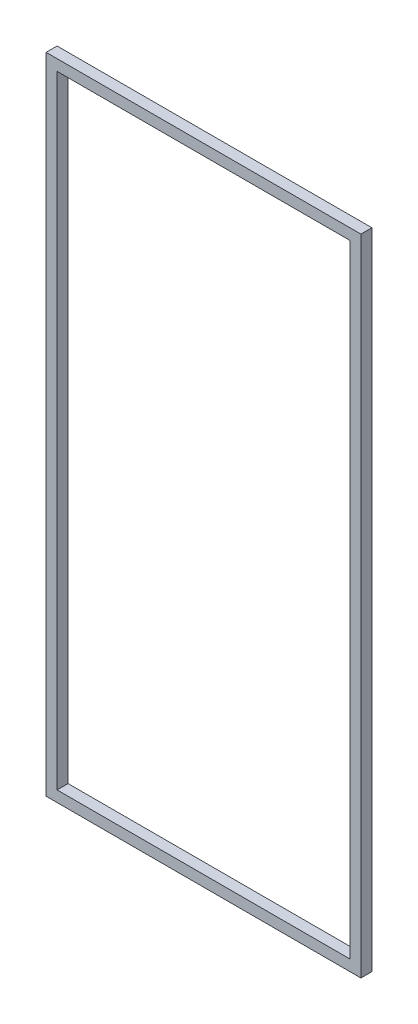
ISO-10303-21;
HEADER;
FILE_DESCRIPTION(('STEP AP214'),'2;1');
FILE_NAME('part.step','',(''),(''),'','','');
FILE_SCHEMA(('AUTOMOTIVE_DESIGN { 1 0 10303 214 1 1 1 1 }'));
ENDSEC;
DATA;
#1=APPLICATION_CONTEXT('core data for automotive mechanical design processes');
#2=APPLICATION_PROTOCOL_DEFINITION('international standard','automotive_design',2000,#1);
#3=PRODUCT_CONTEXT('',#1,'mechanical');
#4=PRODUCT('Part','Part','',(#3));
#5=PRODUCT_RELATED_PRODUCT_CATEGORY('part','',(#4));
#6=PRODUCT_DEFINITION_FORMATION('','',#4);
#7=PRODUCT_DEFINITION_CONTEXT('part definition',#1,'design');
#8=PRODUCT_DEFINITION('design','',#6,#7);
#9=PRODUCT_DEFINITION_SHAPE('','',#8);
#10=(LENGTH_UNIT() NAMED_UNIT(*) SI_UNIT(.MILLI.,.METRE.));
#11=(NAMED_UNIT(*) PLANE_ANGLE_UNIT() SI_UNIT($,.RADIAN.));
#12=(NAMED_UNIT(*) SI_UNIT($,.STERADIAN.) SOLID_ANGLE_UNIT());
#13=UNCERTAINTY_MEASURE_WITH_UNIT(LENGTH_MEASURE(1.E-05),#10,'distance_accuracy_value','');
#14=(GEOMETRIC_REPRESENTATION_CONTEXT(3) GLOBAL_UNCERTAINTY_ASSIGNED_CONTEXT((#13)) GLOBAL_UNIT_ASSIGNED_CONTEXT((#10,
#11,#12)) REPRESENTATION_CONTEXT('',''));
#15=CARTESIAN_POINT('',(0.,0.,0.));
#16=DIRECTION('',(0.,0.,1.));
#17=DIRECTION('',(1.,0.,0.));
#18=AXIS2_PLACEMENT_3D('',#15,#16,#17);
#19=CARTESIAN_POINT('',(0.,0.,15.));
#20=DIRECTION('',(0.,0.,1.));
#21=DIRECTION('',(1.,0.,0.));
#22=AXIS2_PLACEMENT_3D('',#19,#20,#21);
#23=PLANE('',#22);
#24=DIRECTION('',(0.,1.,0.));
#25=VECTOR('',#24,1.);
#26=CARTESIAN_POINT('',(215.,425.,15.));
#27=LINE('',#26,#25);
#28=CARTESIAN_POINT('',(215.,-440.,15.));
#29=VERTEX_POINT('',#28);
#30=CARTESIAN_POINT('',(215.,440.,15.));
#31=VERTEX_POINT('',#30);
#32=EDGE_CURVE('E160',#29,#31,#27,.T.);
#33=ORIENTED_EDGE('',*,*,#32,.T.);
#34=DIRECTION('',(-1.,0.,0.));
#35=VECTOR('',#34,1.);
#36=CARTESIAN_POINT('',(-200.,440.,15.));
#37=LINE('',#36,#35);
#38=CARTESIAN_POINT('',(-215.,440.,15.));
#39=VERTEX_POINT('',#38);
#40=EDGE_CURVE('E163',#31,#39,#37,.T.);
#41=ORIENTED_EDGE('',*,*,#40,.T.);
#42=DIRECTION('',(0.,-1.,0.));
#43=VECTOR('',#42,1.);
#44=CARTESIAN_POINT('',(-215.,425.,15.));
#45=LINE('',#44,#43);
#46=CARTESIAN_POINT('',(-215.,-440.,15.));
#47=VERTEX_POINT('',#46);
#48=EDGE_CURVE('E166',#39,#47,#45,.T.);
#49=ORIENTED_EDGE('',*,*,#48,.T.);
#50=DIRECTION('',(1.,0.,0.));
#51=VECTOR('',#50,1.);
#52=CARTESIAN_POINT('',(-200.,-440.,15.));
#53=LINE('',#52,#51);
#54=EDGE_CURVE('E168',#47,#29,#53,.T.);
#55=ORIENTED_EDGE('',*,*,#54,.T.);
#56=EDGE_LOOP('',(#33,#41,#49,#55));
#57=FACE_BOUND('',#56,.T.);
#58=DIRECTION('',(-1.,0.,0.));
#59=VECTOR('',#58,1.);
#60=CARTESIAN_POINT('',(-200.,425.,15.));
#61=LINE('',#60,#59);
#62=CARTESIAN_POINT('',(200.,425.,15.));
#63=VERTEX_POINT('',#62);
#64=CARTESIAN_POINT('',(-200.,425.,15.));
#65=VERTEX_POINT('',#64);
#66=EDGE_CURVE('E132',#63,#65,#61,.T.);
#67=ORIENTED_EDGE('',*,*,#66,.F.);
#68=DIRECTION('',(0.,1.,0.));
#69=VECTOR('',#68,1.);
#70=CARTESIAN_POINT('',(200.,425.,15.));
#71=LINE('',#70,#69);
#72=CARTESIAN_POINT('',(200.,-425.,15.));
#73=VERTEX_POINT('',#72);
#74=EDGE_CURVE('E124',#73,#63,#71,.T.);
#75=ORIENTED_EDGE('',*,*,#74,.F.);
#76=DIRECTION('',(1.,0.,0.));
#77=VECTOR('',#76,1.);
#78=CARTESIAN_POINT('',(-200.,-425.,15.));
#79=LINE('',#78,#77);
#80=CARTESIAN_POINT('',(-200.,-425.,15.));
#81=VERTEX_POINT('',#80);
#82=EDGE_CURVE('E146',#81,#73,#79,.T.);
#83=ORIENTED_EDGE('',*,*,#82,.F.);
#84=DIRECTION('',(0.,-1.,0.));
#85=VECTOR('',#84,1.);
#86=CARTESIAN_POINT('',(-200.,425.,15.));
#87=LINE('',#86,#85);
#88=EDGE_CURVE('E144',#65,#81,#87,.T.);
#89=ORIENTED_EDGE('',*,*,#88,.F.);
#90=EDGE_LOOP('',(#67,#75,#83,#89));
#91=FACE_BOUND('',#90,.T.);
#92=ADVANCED_FACE('F59',(#57,#91),#23,.T.);
#93=CARTESIAN_POINT('',(0.,0.,0.));
#94=DIRECTION('',(0.,0.,1.));
#95=DIRECTION('',(1.,0.,0.));
#96=AXIS2_PLACEMENT_3D('',#93,#94,#95);
#97=PLANE('',#96);
#98=DIRECTION('',(0.,1.,0.));
#99=VECTOR('',#98,1.);
#100=CARTESIAN_POINT('',(215.,425.,0.));
#101=LINE('',#100,#99);
#102=CARTESIAN_POINT('',(215.,-440.,0.));
#103=VERTEX_POINT('',#102);
#104=CARTESIAN_POINT('',(215.,440.,0.));
#105=VERTEX_POINT('',#104);
#106=EDGE_CURVE('E140',#103,#105,#101,.T.);
#107=ORIENTED_EDGE('',*,*,#106,.F.);
#108=DIRECTION('',(1.,0.,0.));
#109=VECTOR('',#108,1.);
#110=CARTESIAN_POINT('',(-200.,-440.,0.));
#111=LINE('',#110,#109);
#112=CARTESIAN_POINT('',(-215.,-440.,0.));
#113=VERTEX_POINT('',#112);
#114=EDGE_CURVE('E164',#113,#103,#111,.T.);
#115=ORIENTED_EDGE('',*,*,#114,.F.);
#116=DIRECTION('',(0.,-1.,0.));
#117=VECTOR('',#116,1.);
#118=CARTESIAN_POINT('',(-215.,425.,0.));
#119=LINE('',#118,#117);
#120=CARTESIAN_POINT('',(-215.,440.,0.));
#121=VERTEX_POINT('',#120);
#122=EDGE_CURVE('E175',#121,#113,#119,.T.);
#123=ORIENTED_EDGE('',*,*,#122,.F.);
#124=DIRECTION('',(-1.,0.,0.));
#125=VECTOR('',#124,1.);
#126=CARTESIAN_POINT('',(-200.,440.,0.));
#127=LINE('',#126,#125);
#128=EDGE_CURVE('E173',#105,#121,#127,.T.);
#129=ORIENTED_EDGE('',*,*,#128,.F.);
#130=EDGE_LOOP('',(#107,#115,#123,#129));
#131=FACE_BOUND('',#130,.T.);
#132=DIRECTION('',(0.,1.,0.));
#133=VECTOR('',#132,1.);
#134=CARTESIAN_POINT('',(200.,425.,0.));
#135=LINE('',#134,#133);
#136=CARTESIAN_POINT('',(200.,-425.,0.));
#137=VERTEX_POINT('',#136);
#138=CARTESIAN_POINT('',(200.,425.,0.));
#139=VERTEX_POINT('',#138);
#140=EDGE_CURVE('E82',#137,#139,#135,.T.);
#141=ORIENTED_EDGE('',*,*,#140,.T.);
#142=DIRECTION('',(-1.,0.,0.));
#143=VECTOR('',#142,1.);
#144=CARTESIAN_POINT('',(-200.,425.,0.));
#145=LINE('',#144,#143);
#146=CARTESIAN_POINT('',(-200.,425.,0.));
#147=VERTEX_POINT('',#146);
#148=EDGE_CURVE('E139',#139,#147,#145,.T.);
#149=ORIENTED_EDGE('',*,*,#148,.T.);
#150=DIRECTION('',(0.,-1.,0.));
#151=VECTOR('',#150,1.);
#152=CARTESIAN_POINT('',(-200.,425.,0.));
#153=LINE('',#152,#151);
#154=CARTESIAN_POINT('',(-200.,-425.,0.));
#155=VERTEX_POINT('',#154);
#156=EDGE_CURVE('E152',#147,#155,#153,.T.);
#157=ORIENTED_EDGE('',*,*,#156,.T.);
#158=DIRECTION('',(1.,0.,0.));
#159=VECTOR('',#158,1.);
#160=CARTESIAN_POINT('',(-200.,-425.,0.));
#161=LINE('',#160,#159);
#162=EDGE_CURVE('E133',#155,#137,#161,.T.);
#163=ORIENTED_EDGE('',*,*,#162,.T.);
#164=EDGE_LOOP('',(#141,#149,#157,#163));
#165=FACE_BOUND('',#164,.T.);
#166=ADVANCED_FACE('F193',(#131,#165),#97,.F.);
#167=CARTESIAN_POINT('',(215.,425.,15.));
#168=DIRECTION('',(-1.,0.,0.));
#169=DIRECTION('',(0.,-1.,0.));
#170=AXIS2_PLACEMENT_3D('',#167,#168,#169);
#171=PLANE('',#170);
#172=ORIENTED_EDGE('',*,*,#106,.T.);
#173=DIRECTION('',(0.,0.,-1.));
#174=VECTOR('',#173,1.);
#175=CARTESIAN_POINT('',(215.,440.,15.));
#176=LINE('',#175,#174);
#177=EDGE_CURVE('E12',#31,#105,#176,.T.);
#178=ORIENTED_EDGE('',*,*,#177,.F.);
#179=ORIENTED_EDGE('',*,*,#32,.F.);
#180=DIRECTION('',(0.,0.,-1.));
#181=VECTOR('',#180,1.);
#182=CARTESIAN_POINT('',(215.,-440.,15.));
#183=LINE('',#182,#181);
#184=EDGE_CURVE('E170',#29,#103,#183,.T.);
#185=ORIENTED_EDGE('',*,*,#184,.T.);
#186=EDGE_LOOP('',(#172,#178,#179,#185));
#187=FACE_BOUND('',#186,.T.);
#188=ADVANCED_FACE('F61',(#187),#171,.F.);
#189=CARTESIAN_POINT('',(-200.,440.,15.));
#190=DIRECTION('',(0.,-1.,0.));
#191=DIRECTION('',(0.,0.,-1.));
#192=AXIS2_PLACEMENT_3D('',#189,#190,#191);
#193=PLANE('',#192);
#194=ORIENTED_EDGE('',*,*,#128,.T.);
#195=DIRECTION('',(0.,0.,-1.));
#196=VECTOR('',#195,1.);
#197=CARTESIAN_POINT('',(-215.,440.,15.));
#198=LINE('',#197,#196);
#199=EDGE_CURVE('E67',#39,#121,#198,.T.);
#200=ORIENTED_EDGE('',*,*,#199,.F.);
#201=ORIENTED_EDGE('',*,*,#40,.F.);
#202=ORIENTED_EDGE('',*,*,#177,.T.);
#203=EDGE_LOOP('',(#194,#200,#201,#202));
#204=FACE_BOUND('',#203,.T.);
#205=ADVANCED_FACE('F203',(#204),#193,.F.);
#206=CARTESIAN_POINT('',(-215.,425.,15.));
#207=DIRECTION('',(1.,0.,0.));
#208=DIRECTION('',(0.,1.,0.));
#209=AXIS2_PLACEMENT_3D('',#206,#207,#208);
#210=PLANE('',#209);
#211=ORIENTED_EDGE('',*,*,#122,.T.);
#212=DIRECTION('',(0.,0.,-1.));
#213=VECTOR('',#212,1.);
#214=CARTESIAN_POINT('',(-215.,-440.,15.));
#215=LINE('',#214,#213);
#216=EDGE_CURVE('E180',#47,#113,#215,.T.);
#217=ORIENTED_EDGE('',*,*,#216,.F.);
#218=ORIENTED_EDGE('',*,*,#48,.F.);
#219=ORIENTED_EDGE('',*,*,#199,.T.);
#220=EDGE_LOOP('',(#211,#217,#218,#219));
#221=FACE_BOUND('',#220,.T.);
#222=ADVANCED_FACE('F187',(#221),#210,.F.);
#223=CARTESIAN_POINT('',(-200.,-440.,15.));
#224=DIRECTION('',(0.,1.,0.));
#225=DIRECTION('',(0.,0.,1.));
#226=AXIS2_PLACEMENT_3D('',#223,#224,#225);
#227=PLANE('',#226);
#228=ORIENTED_EDGE('',*,*,#114,.T.);
#229=ORIENTED_EDGE('',*,*,#184,.F.);
#230=ORIENTED_EDGE('',*,*,#54,.F.);
#231=ORIENTED_EDGE('',*,*,#216,.T.);
#232=EDGE_LOOP('',(#228,#229,#230,#231));
#233=FACE_BOUND('',#232,.T.);
#234=ADVANCED_FACE('F197',(#233),#227,.F.);
#235=CARTESIAN_POINT('',(200.,425.,15.));
#236=DIRECTION('',(-1.,0.,0.));
#237=DIRECTION('',(0.,-1.,0.));
#238=AXIS2_PLACEMENT_3D('',#235,#236,#237);
#239=PLANE('',#238);
#240=ORIENTED_EDGE('',*,*,#140,.F.);
#241=DIRECTION('',(0.,0.,-1.));
#242=VECTOR('',#241,1.);
#243=CARTESIAN_POINT('',(200.,-425.,15.));
#244=LINE('',#243,#242);
#245=EDGE_CURVE('E128',#73,#137,#244,.T.);
#246=ORIENTED_EDGE('',*,*,#245,.F.);
#247=ORIENTED_EDGE('',*,*,#74,.T.);
#248=DIRECTION('',(0.,0.,-1.));
#249=VECTOR('',#248,1.);
#250=CARTESIAN_POINT('',(200.,425.,15.));
#251=LINE('',#250,#249);
#252=EDGE_CURVE('E127',#63,#139,#251,.T.);
#253=ORIENTED_EDGE('',*,*,#252,.T.);
#254=EDGE_LOOP('',(#240,#246,#247,#253));
#255=FACE_BOUND('',#254,.T.);
#256=ADVANCED_FACE('F126',(#255),#239,.T.);
#257=CARTESIAN_POINT('',(-200.,425.,15.));
#258=DIRECTION('',(0.,-1.,0.));
#259=DIRECTION('',(0.,0.,-1.));
#260=AXIS2_PLACEMENT_3D('',#257,#258,#259);
#261=PLANE('',#260);
#262=ORIENTED_EDGE('',*,*,#148,.F.);
#263=ORIENTED_EDGE('',*,*,#252,.F.);
#264=ORIENTED_EDGE('',*,*,#66,.T.);
#265=DIRECTION('',(0.,0.,-1.));
#266=VECTOR('',#265,1.);
#267=CARTESIAN_POINT('',(-200.,425.,15.));
#268=LINE('',#267,#266);
#269=EDGE_CURVE('E141',#65,#147,#268,.T.);
#270=ORIENTED_EDGE('',*,*,#269,.T.);
#271=EDGE_LOOP('',(#262,#263,#264,#270));
#272=FACE_BOUND('',#271,.T.);
#273=ADVANCED_FACE('F136',(#272),#261,.T.);
#274=CARTESIAN_POINT('',(-200.,425.,15.));
#275=DIRECTION('',(1.,0.,0.));
#276=DIRECTION('',(0.,1.,0.));
#277=AXIS2_PLACEMENT_3D('',#274,#275,#276);
#278=PLANE('',#277);
#279=ORIENTED_EDGE('',*,*,#156,.F.);
#280=ORIENTED_EDGE('',*,*,#269,.F.);
#281=ORIENTED_EDGE('',*,*,#88,.T.);
#282=DIRECTION('',(0.,0.,-1.));
#283=VECTOR('',#282,1.);
#284=CARTESIAN_POINT('',(-200.,-425.,15.));
#285=LINE('',#284,#283);
#286=EDGE_CURVE('E74',#81,#155,#285,.T.);
#287=ORIENTED_EDGE('',*,*,#286,.T.);
#288=EDGE_LOOP('',(#279,#280,#281,#287));
#289=FACE_BOUND('',#288,.T.);
#290=ADVANCED_FACE('F226',(#289),#278,.T.);
#291=CARTESIAN_POINT('',(-200.,-425.,15.));
#292=DIRECTION('',(0.,1.,0.));
#293=DIRECTION('',(0.,0.,1.));
#294=AXIS2_PLACEMENT_3D('',#291,#292,#293);
#295=PLANE('',#294);
#296=ORIENTED_EDGE('',*,*,#162,.F.);
#297=ORIENTED_EDGE('',*,*,#286,.F.);
#298=ORIENTED_EDGE('',*,*,#82,.T.);
#299=ORIENTED_EDGE('',*,*,#245,.T.);
#300=EDGE_LOOP('',(#296,#297,#298,#299));
#301=FACE_BOUND('',#300,.T.);
#302=ADVANCED_FACE('F230',(#301),#295,.T.);
#303=CLOSED_SHELL('',(#92,#166,#188,#205,#222,#234,#256,#273,#290,#302));
#304=MANIFOLD_SOLID_BREP('B2',#303);
#305=ADVANCED_BREP_SHAPE_REPRESENTATION('',(#18,#304),#14);
#306=SHAPE_DEFINITION_REPRESENTATION(#9,#305);
ENDSEC;
END-ISO-10303-21;
